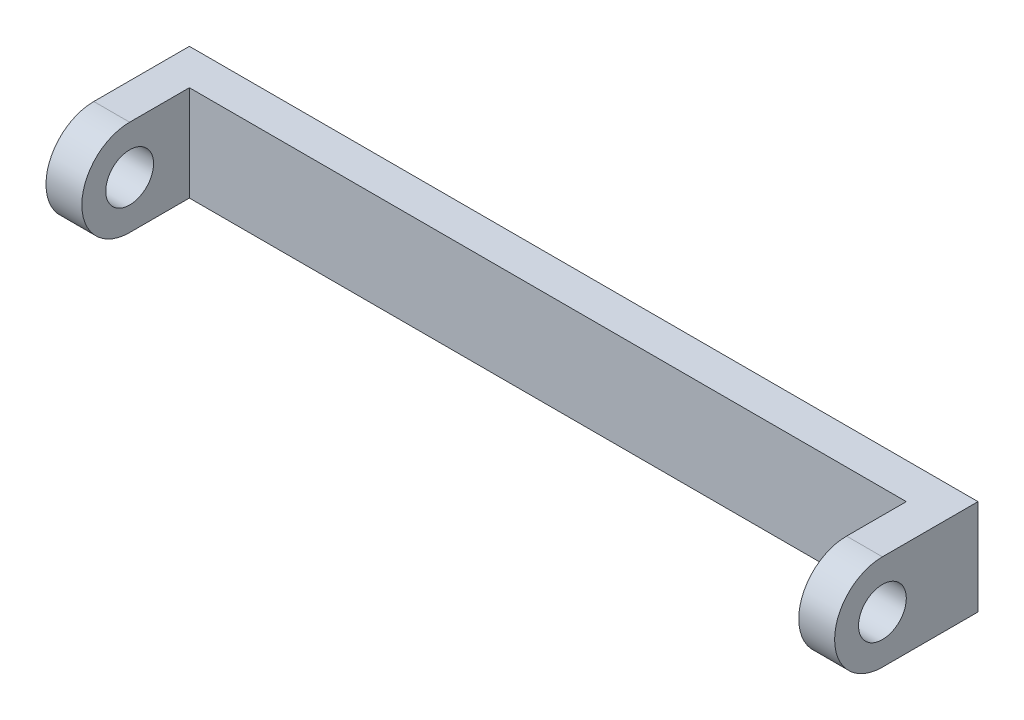
ISO-10303-21;
HEADER;
FILE_DESCRIPTION(('STEP AP214'),'2;1');
FILE_NAME('part.step','',(''),(''),'','','');
FILE_SCHEMA(('AUTOMOTIVE_DESIGN { 1 0 10303 214 1 1 1 1 }'));
ENDSEC;
DATA;
#1=APPLICATION_CONTEXT('core data for automotive mechanical design processes');
#2=APPLICATION_PROTOCOL_DEFINITION('international standard','automotive_design',2000,#1);
#3=PRODUCT_CONTEXT('',#1,'mechanical');
#4=PRODUCT('Part','Part','',(#3));
#5=PRODUCT_RELATED_PRODUCT_CATEGORY('part','',(#4));
#6=PRODUCT_DEFINITION_FORMATION('','',#4);
#7=PRODUCT_DEFINITION_CONTEXT('part definition',#1,'design');
#8=PRODUCT_DEFINITION('design','',#6,#7);
#9=PRODUCT_DEFINITION_SHAPE('','',#8);
#10=(LENGTH_UNIT() NAMED_UNIT(*) SI_UNIT(.MILLI.,.METRE.));
#11=(NAMED_UNIT(*) PLANE_ANGLE_UNIT() SI_UNIT($,.RADIAN.));
#12=(NAMED_UNIT(*) SI_UNIT($,.STERADIAN.) SOLID_ANGLE_UNIT());
#13=UNCERTAINTY_MEASURE_WITH_UNIT(LENGTH_MEASURE(1.E-05),#10,'distance_accuracy_value','');
#14=(GEOMETRIC_REPRESENTATION_CONTEXT(3) GLOBAL_UNCERTAINTY_ASSIGNED_CONTEXT((#13)) GLOBAL_UNIT_ASSIGNED_CONTEXT((#10,
#11,#12)) REPRESENTATION_CONTEXT('',''));
#15=CARTESIAN_POINT('',(0.,0.,0.));
#16=DIRECTION('',(0.,0.,1.));
#17=DIRECTION('',(1.,0.,0.));
#18=AXIS2_PLACEMENT_3D('',#15,#16,#17);
#19=CARTESIAN_POINT('',(28.6043426878874,1.33562795041826,8.00000000000003));
#20=DIRECTION('',(-1.,0.,0.));
#21=DIRECTION('',(0.,-1.,0.));
#22=AXIS2_PLACEMENT_3D('',#19,#20,#21);
#23=CYLINDRICAL_SURFACE('',#22,3.99999999999999);
#24=DIRECTION('',(1.,0.,0.));
#25=VECTOR('',#24,1.);
#26=CARTESIAN_POINT('',(28.6043426878874,-2.66437204958177,8.00000000000003));
#27=LINE('',#26,#25);
#28=CARTESIAN_POINT('',(28.6043426878874,-2.66437204958171,8.00000000000003));
#29=VERTEX_POINT('',#28);
#30=CARTESIAN_POINT('',(25.6043426878874,-2.66437204958172,8.00000000000003));
#31=VERTEX_POINT('',#30);
#32=EDGE_CURVE('E155',#29,#31,#27,.F.);
#33=ORIENTED_EDGE('',*,*,#32,.F.);
#34=CARTESIAN_POINT('',(28.6043426878874,1.33562795041826,8.00000000000003));
#35=DIRECTION('',(1.,0.,0.));
#36=DIRECTION('',(0.,1.,0.));
#37=AXIS2_PLACEMENT_3D('',#34,#35,#36);
#38=CIRCLE('',#37,3.99999999999999);
#39=CARTESIAN_POINT('',(28.6043426878874,5.33562795041829,7.99999999999997));
#40=VERTEX_POINT('',#39);
#41=EDGE_CURVE('E51',#40,#29,#38,.T.);
#42=ORIENTED_EDGE('',*,*,#41,.F.);
#43=DIRECTION('',(-1.,0.,0.));
#44=VECTOR('',#43,1.);
#45=CARTESIAN_POINT('',(0.,5.33562795041823,8.00000000000003));
#46=LINE('',#45,#44);
#47=CARTESIAN_POINT('',(25.6043426878874,5.33562795041829,7.99999999999997));
#48=VERTEX_POINT('',#47);
#49=EDGE_CURVE('E158',#48,#40,#46,.F.);
#50=ORIENTED_EDGE('',*,*,#49,.F.);
#51=CARTESIAN_POINT('',(25.6043426878874,1.33562795041825,8.00000000000003));
#52=DIRECTION('',(-1.,0.,0.));
#53=DIRECTION('',(0.,-1.,0.));
#54=AXIS2_PLACEMENT_3D('',#51,#52,#53);
#55=CIRCLE('',#54,3.99999999999999);
#56=EDGE_CURVE('E11',#31,#48,#55,.T.);
#57=ORIENTED_EDGE('',*,*,#56,.F.);
#58=EDGE_LOOP('',(#33,#42,#50,#57));
#59=FACE_BOUND('',#58,.T.);
#60=ADVANCED_FACE('F43',(#59),#23,.T.);
#61=CARTESIAN_POINT('',(-34.3956573121126,1.33562795041823,8.));
#62=DIRECTION('',(1.,0.,0.));
#63=DIRECTION('',(0.,0.,-1.));
#64=AXIS2_PLACEMENT_3D('',#61,#62,#63);
#65=CYLINDRICAL_SURFACE('',#64,4.);
#66=DIRECTION('',(-1.,0.,0.));
#67=VECTOR('',#66,1.);
#68=CARTESIAN_POINT('',(-34.3956573121126,-2.66437204958177,8.));
#69=LINE('',#68,#67);
#70=CARTESIAN_POINT('',(-34.3956573121126,-2.66437204958177,8.));
#71=VERTEX_POINT('',#70);
#72=CARTESIAN_POINT('',(-37.3956573121126,-2.66437204958177,8.));
#73=VERTEX_POINT('',#72);
#74=EDGE_CURVE('E146',#71,#73,#69,.T.);
#75=ORIENTED_EDGE('',*,*,#74,.F.);
#76=CARTESIAN_POINT('',(-34.3956573121126,1.33562795041823,8.));
#77=DIRECTION('',(-1.,0.,0.));
#78=DIRECTION('',(0.,0.,1.));
#79=AXIS2_PLACEMENT_3D('',#76,#77,#78);
#80=CIRCLE('',#79,4.);
#81=CARTESIAN_POINT('',(-34.3956573121126,5.33562795041824,8.));
#82=VERTEX_POINT('',#81);
#83=EDGE_CURVE('E151',#82,#71,#80,.F.);
#84=ORIENTED_EDGE('',*,*,#83,.F.);
#85=DIRECTION('',(1.,0.,0.));
#86=VECTOR('',#85,1.);
#87=CARTESIAN_POINT('',(0.,5.33562795041823,8.));
#88=LINE('',#87,#86);
#89=CARTESIAN_POINT('',(-37.3956573121126,5.33562795041824,8.));
#90=VERTEX_POINT('',#89);
#91=EDGE_CURVE('E149',#90,#82,#88,.T.);
#92=ORIENTED_EDGE('',*,*,#91,.F.);
#93=CARTESIAN_POINT('',(-37.3956573121126,1.33562795041823,8.));
#94=DIRECTION('',(1.,0.,0.));
#95=DIRECTION('',(0.,1.,0.));
#96=AXIS2_PLACEMENT_3D('',#93,#94,#95);
#97=CIRCLE('',#96,4.);
#98=EDGE_CURVE('E153',#73,#90,#97,.F.);
#99=ORIENTED_EDGE('',*,*,#98,.F.);
#100=EDGE_LOOP('',(#75,#84,#92,#99));
#101=FACE_BOUND('',#100,.T.);
#102=ADVANCED_FACE('F210',(#101),#65,.T.);
#103=CARTESIAN_POINT('',(-37.3956573121126,0.,3.));
#104=DIRECTION('',(1.,0.,0.));
#105=DIRECTION('',(0.,1.,0.));
#106=AXIS2_PLACEMENT_3D('',#103,#104,#105);
#107=PLANE('',#106);
#108=CARTESIAN_POINT('',(-37.3956573121126,1.33562795041823,8.));
#109=DIRECTION('',(1.,0.,0.));
#110=DIRECTION('',(0.,0.,-1.));
#111=AXIS2_PLACEMENT_3D('',#108,#109,#110);
#112=CIRCLE('',#111,2.);
#113=CARTESIAN_POINT('',(-37.3956573121126,1.33562795041823,6.));
#114=VERTEX_POINT('',#113);
#115=EDGE_CURVE('E175',#114,#114,#112,.T.);
#116=ORIENTED_EDGE('',*,*,#115,.T.);
#117=EDGE_LOOP('',(#116));
#118=FACE_BOUND('',#117,.T.);
#119=DIRECTION('',(0.,0.,-1.));
#120=VECTOR('',#119,1.);
#121=CARTESIAN_POINT('',(-37.3956573121126,-2.66437204958177,3.));
#122=LINE('',#121,#120);
#123=CARTESIAN_POINT('',(-37.3956573121126,-2.66437204958177,0.));
#124=VERTEX_POINT('',#123);
#125=EDGE_CURVE('E130',#73,#124,#122,.T.);
#126=ORIENTED_EDGE('',*,*,#125,.F.);
#127=ORIENTED_EDGE('',*,*,#98,.T.);
#128=DIRECTION('',(0.,0.,-1.));
#129=VECTOR('',#128,1.);
#130=CARTESIAN_POINT('',(-37.3956573121126,5.33562795041824,3.));
#131=LINE('',#130,#129);
#132=CARTESIAN_POINT('',(-37.3956573121126,5.33562795041824,0.));
#133=VERTEX_POINT('',#132);
#134=EDGE_CURVE('E128',#90,#133,#131,.T.);
#135=ORIENTED_EDGE('',*,*,#134,.T.);
#136=DIRECTION('',(0.,-1.,0.));
#137=VECTOR('',#136,1.);
#138=CARTESIAN_POINT('',(-37.3956573121126,0.,0.));
#139=LINE('',#138,#137);
#140=EDGE_CURVE('E136',#133,#124,#139,.T.);
#141=ORIENTED_EDGE('',*,*,#140,.T.);
#142=EDGE_LOOP('',(#126,#127,#135,#141));
#143=FACE_BOUND('',#142,.T.);
#144=ADVANCED_FACE('F215',(#118,#143),#107,.F.);
#145=CARTESIAN_POINT('',(0.,-2.66437204958177,3.));
#146=DIRECTION('',(0.,1.,0.));
#147=DIRECTION('',(0.,0.,1.));
#148=AXIS2_PLACEMENT_3D('',#145,#146,#147);
#149=PLANE('',#148);
#150=DIRECTION('',(0.,0.,-1.));
#151=VECTOR('',#150,1.);
#152=CARTESIAN_POINT('',(28.6043426878874,-2.66437204958171,3.));
#153=LINE('',#152,#151);
#154=CARTESIAN_POINT('',(28.6043426878874,-2.66437204958171,0.));
#155=VERTEX_POINT('',#154);
#156=EDGE_CURVE('E164',#29,#155,#153,.T.);
#157=ORIENTED_EDGE('',*,*,#156,.F.);
#158=ORIENTED_EDGE('',*,*,#32,.T.);
#159=DIRECTION('',(0.,0.,-1.));
#160=VECTOR('',#159,1.);
#161=CARTESIAN_POINT('',(25.6043426878874,-2.66437204958172,12.));
#162=LINE('',#161,#160);
#163=CARTESIAN_POINT('',(25.6043426878874,-2.66437204958172,3.));
#164=VERTEX_POINT('',#163);
#165=EDGE_CURVE('E112',#31,#164,#162,.T.);
#166=ORIENTED_EDGE('',*,*,#165,.T.);
#167=DIRECTION('',(1.,0.,0.));
#168=VECTOR('',#167,1.);
#169=CARTESIAN_POINT('',(0.,-2.66437204958177,3.));
#170=LINE('',#169,#168);
#171=CARTESIAN_POINT('',(-34.3956573121126,-2.66437204958177,3.));
#172=VERTEX_POINT('',#171);
#173=EDGE_CURVE('E121',#172,#164,#170,.T.);
#174=ORIENTED_EDGE('',*,*,#173,.F.);
#175=DIRECTION('',(0.,0.,-1.));
#176=VECTOR('',#175,1.);
#177=CARTESIAN_POINT('',(-34.3956573121126,-2.66437204958177,12.));
#178=LINE('',#177,#176);
#179=EDGE_CURVE('E140',#71,#172,#178,.T.);
#180=ORIENTED_EDGE('',*,*,#179,.F.);
#181=ORIENTED_EDGE('',*,*,#74,.T.);
#182=ORIENTED_EDGE('',*,*,#125,.T.);
#183=DIRECTION('',(1.,0.,0.));
#184=VECTOR('',#183,1.);
#185=CARTESIAN_POINT('',(0.,-2.66437204958177,0.));
#186=LINE('',#185,#184);
#187=EDGE_CURVE('E139',#124,#155,#186,.T.);
#188=ORIENTED_EDGE('',*,*,#187,.T.);
#189=EDGE_LOOP('',(#157,#158,#166,#174,#180,#181,#182,#188));
#190=FACE_BOUND('',#189,.T.);
#191=ADVANCED_FACE('F167',(#190),#149,.F.);
#192=CARTESIAN_POINT('',(0.,5.33562795041823,3.));
#193=DIRECTION('',(0.,1.,0.));
#194=DIRECTION('',(-1.,0.,0.));
#195=AXIS2_PLACEMENT_3D('',#192,#193,#194);
#196=PLANE('',#195);
#197=DIRECTION('',(0.,0.,-1.));
#198=VECTOR('',#197,1.);
#199=CARTESIAN_POINT('',(25.6043426878874,5.33562795041829,12.));
#200=LINE('',#199,#198);
#201=CARTESIAN_POINT('',(25.6043426878874,5.33562795041829,3.));
#202=VERTEX_POINT('',#201);
#203=EDGE_CURVE('E104',#48,#202,#200,.T.);
#204=ORIENTED_EDGE('',*,*,#203,.F.);
#205=ORIENTED_EDGE('',*,*,#49,.T.);
#206=DIRECTION('',(0.,0.,-1.));
#207=VECTOR('',#206,1.);
#208=CARTESIAN_POINT('',(28.6043426878874,5.33562795041829,3.));
#209=LINE('',#208,#207);
#210=CARTESIAN_POINT('',(28.6043426878874,5.33562795041829,0.));
#211=VERTEX_POINT('',#210);
#212=EDGE_CURVE('E165',#40,#211,#209,.T.);
#213=ORIENTED_EDGE('',*,*,#212,.T.);
#214=DIRECTION('',(1.,0.,0.));
#215=VECTOR('',#214,1.);
#216=CARTESIAN_POINT('',(0.,5.33562795041823,0.));
#217=LINE('',#216,#215);
#218=EDGE_CURVE('E132',#133,#211,#217,.T.);
#219=ORIENTED_EDGE('',*,*,#218,.F.);
#220=ORIENTED_EDGE('',*,*,#134,.F.);
#221=ORIENTED_EDGE('',*,*,#91,.T.);
#222=DIRECTION('',(0.,0.,-1.));
#223=VECTOR('',#222,1.);
#224=CARTESIAN_POINT('',(-34.3956573121126,5.33562795041824,12.));
#225=LINE('',#224,#223);
#226=CARTESIAN_POINT('',(-34.3956573121126,5.33562795041824,3.));
#227=VERTEX_POINT('',#226);
#228=EDGE_CURVE('E127',#82,#227,#225,.T.);
#229=ORIENTED_EDGE('',*,*,#228,.T.);
#230=DIRECTION('',(1.,0.,0.));
#231=VECTOR('',#230,1.);
#232=CARTESIAN_POINT('',(0.,5.33562795041823,3.));
#233=LINE('',#232,#231);
#234=EDGE_CURVE('E118',#227,#202,#233,.T.);
#235=ORIENTED_EDGE('',*,*,#234,.T.);
#236=EDGE_LOOP('',(#204,#205,#213,#219,#220,#221,#229,#235));
#237=FACE_BOUND('',#236,.T.);
#238=ADVANCED_FACE('F124',(#237),#196,.T.);
#239=CARTESIAN_POINT('',(0.,0.,3.));
#240=DIRECTION('',(0.,0.,1.));
#241=DIRECTION('',(1.,0.,0.));
#242=AXIS2_PLACEMENT_3D('',#239,#240,#241);
#243=PLANE('',#242);
#244=DIRECTION('',(0.,1.,0.));
#245=VECTOR('',#244,1.);
#246=CARTESIAN_POINT('',(25.6043426878874,5.33562795041829,3.));
#247=LINE('',#246,#245);
#248=EDGE_CURVE('E107',#164,#202,#247,.T.);
#249=ORIENTED_EDGE('',*,*,#248,.T.);
#250=ORIENTED_EDGE('',*,*,#234,.F.);
#251=DIRECTION('',(0.,1.,0.));
#252=VECTOR('',#251,1.);
#253=CARTESIAN_POINT('',(-34.3956573121126,5.33562795041824,3.));
#254=LINE('',#253,#252);
#255=EDGE_CURVE('E178',#172,#227,#254,.T.);
#256=ORIENTED_EDGE('',*,*,#255,.F.);
#257=ORIENTED_EDGE('',*,*,#173,.T.);
#258=EDGE_LOOP('',(#249,#250,#256,#257));
#259=FACE_BOUND('',#258,.T.);
#260=ADVANCED_FACE('F116',(#259),#243,.T.);
#261=CARTESIAN_POINT('',(0.,0.,0.));
#262=DIRECTION('',(0.,0.,1.));
#263=DIRECTION('',(1.,0.,0.));
#264=AXIS2_PLACEMENT_3D('',#261,#262,#263);
#265=PLANE('',#264);
#266=ORIENTED_EDGE('',*,*,#140,.F.);
#267=ORIENTED_EDGE('',*,*,#218,.T.);
#268=DIRECTION('',(0.,-1.,0.));
#269=VECTOR('',#268,1.);
#270=CARTESIAN_POINT('',(28.6043426878874,0.,0.));
#271=LINE('',#270,#269);
#272=EDGE_CURVE('E111',#211,#155,#271,.T.);
#273=ORIENTED_EDGE('',*,*,#272,.T.);
#274=ORIENTED_EDGE('',*,*,#187,.F.);
#275=EDGE_LOOP('',(#266,#267,#273,#274));
#276=FACE_BOUND('',#275,.T.);
#277=ADVANCED_FACE('F229',(#276),#265,.F.);
#278=CARTESIAN_POINT('',(-34.3956573121126,5.33562795041824,12.));
#279=DIRECTION('',(-1.,0.,0.));
#280=DIRECTION('',(0.,0.,1.));
#281=AXIS2_PLACEMENT_3D('',#278,#279,#280);
#282=PLANE('',#281);
#283=CARTESIAN_POINT('',(-34.3956573121126,1.33562795041823,8.));
#284=DIRECTION('',(1.,0.,0.));
#285=DIRECTION('',(0.,0.,-1.));
#286=AXIS2_PLACEMENT_3D('',#283,#284,#285);
#287=CIRCLE('',#286,2.);
#288=CARTESIAN_POINT('',(-34.3956573121126,1.33562795041823,6.));
#289=VERTEX_POINT('',#288);
#290=EDGE_CURVE('E171',#289,#289,#287,.T.);
#291=ORIENTED_EDGE('',*,*,#290,.F.);
#292=EDGE_LOOP('',(#291));
#293=FACE_BOUND('',#292,.T.);
#294=ORIENTED_EDGE('',*,*,#228,.F.);
#295=ORIENTED_EDGE('',*,*,#83,.T.);
#296=ORIENTED_EDGE('',*,*,#179,.T.);
#297=ORIENTED_EDGE('',*,*,#255,.T.);
#298=EDGE_LOOP('',(#294,#295,#296,#297));
#299=FACE_BOUND('',#298,.T.);
#300=ADVANCED_FACE('F184',(#293,#299),#282,.F.);
#301=CARTESIAN_POINT('',(-37.3956573121126,1.33562795041823,8.));
#302=DIRECTION('',(1.,0.,0.));
#303=DIRECTION('',(0.,0.,-1.));
#304=AXIS2_PLACEMENT_3D('',#301,#302,#303);
#305=CYLINDRICAL_SURFACE('',#304,2.);
#306=ORIENTED_EDGE('',*,*,#115,.F.);
#307=EDGE_LOOP('',(#306));
#308=FACE_BOUND('',#307,.T.);
#309=ORIENTED_EDGE('',*,*,#290,.T.);
#310=EDGE_LOOP('',(#309));
#311=FACE_BOUND('',#310,.T.);
#312=ADVANCED_FACE('F198',(#308,#311),#305,.F.);
#313=CARTESIAN_POINT('',(28.6043426878874,0.,3.));
#314=DIRECTION('',(1.,0.,0.));
#315=DIRECTION('',(0.,1.,0.));
#316=AXIS2_PLACEMENT_3D('',#313,#314,#315);
#317=PLANE('',#316);
#318=CARTESIAN_POINT('',(28.6043426878874,1.33562795041829,8.));
#319=DIRECTION('',(1.,0.,0.));
#320=DIRECTION('',(0.,0.,-1.));
#321=AXIS2_PLACEMENT_3D('',#318,#319,#320);
#322=CIRCLE('',#321,2.);
#323=CARTESIAN_POINT('',(28.6043426878874,1.33562795041829,6.));
#324=VERTEX_POINT('',#323);
#325=EDGE_CURVE('E122',#324,#324,#322,.T.);
#326=ORIENTED_EDGE('',*,*,#325,.F.);
#327=EDGE_LOOP('',(#326));
#328=FACE_BOUND('',#327,.T.);
#329=ORIENTED_EDGE('',*,*,#212,.F.);
#330=ORIENTED_EDGE('',*,*,#41,.T.);
#331=ORIENTED_EDGE('',*,*,#156,.T.);
#332=ORIENTED_EDGE('',*,*,#272,.F.);
#333=EDGE_LOOP('',(#329,#330,#331,#332));
#334=FACE_BOUND('',#333,.T.);
#335=ADVANCED_FACE('F161',(#328,#334),#317,.T.);
#336=CARTESIAN_POINT('',(25.6043426878874,5.33562795041829,12.));
#337=DIRECTION('',(-1.,0.,0.));
#338=DIRECTION('',(0.,-1.,0.));
#339=AXIS2_PLACEMENT_3D('',#336,#337,#338);
#340=PLANE('',#339);
#341=CARTESIAN_POINT('',(25.6043426878874,1.33562795041829,8.));
#342=DIRECTION('',(1.,0.,0.));
#343=DIRECTION('',(0.,0.,-1.));
#344=AXIS2_PLACEMENT_3D('',#341,#342,#343);
#345=CIRCLE('',#344,2.);
#346=CARTESIAN_POINT('',(25.6043426878874,1.33562795041829,6.));
#347=VERTEX_POINT('',#346);
#348=EDGE_CURVE('E188',#347,#347,#345,.T.);
#349=ORIENTED_EDGE('',*,*,#348,.T.);
#350=EDGE_LOOP('',(#349));
#351=FACE_BOUND('',#350,.T.);
#352=ORIENTED_EDGE('',*,*,#165,.F.);
#353=ORIENTED_EDGE('',*,*,#56,.T.);
#354=ORIENTED_EDGE('',*,*,#203,.T.);
#355=ORIENTED_EDGE('',*,*,#248,.F.);
#356=EDGE_LOOP('',(#352,#353,#354,#355));
#357=FACE_BOUND('',#356,.T.);
#358=ADVANCED_FACE('F106',(#351,#357),#340,.T.);
#359=CARTESIAN_POINT('',(28.6043426878874,1.33562795041829,8.));
#360=DIRECTION('',(-1.,0.,0.));
#361=DIRECTION('',(0.,-1.,0.));
#362=AXIS2_PLACEMENT_3D('',#359,#360,#361);
#363=CYLINDRICAL_SURFACE('',#362,2.);
#364=ORIENTED_EDGE('',*,*,#325,.T.);
#365=EDGE_LOOP('',(#364));
#366=FACE_BOUND('',#365,.T.);
#367=ORIENTED_EDGE('',*,*,#348,.F.);
#368=EDGE_LOOP('',(#367));
#369=FACE_BOUND('',#368,.T.);
#370=ADVANCED_FACE('F194',(#366,#369),#363,.F.);
#371=CLOSED_SHELL('',(#60,#102,#144,#191,#238,#260,#277,#300,#312,#335,#358,#370));
#372=MANIFOLD_SOLID_BREP('B2',#371);
#373=ADVANCED_BREP_SHAPE_REPRESENTATION('',(#18,#372),#14);
#374=SHAPE_DEFINITION_REPRESENTATION(#9,#373);
ENDSEC;
END-ISO-10303-21;
